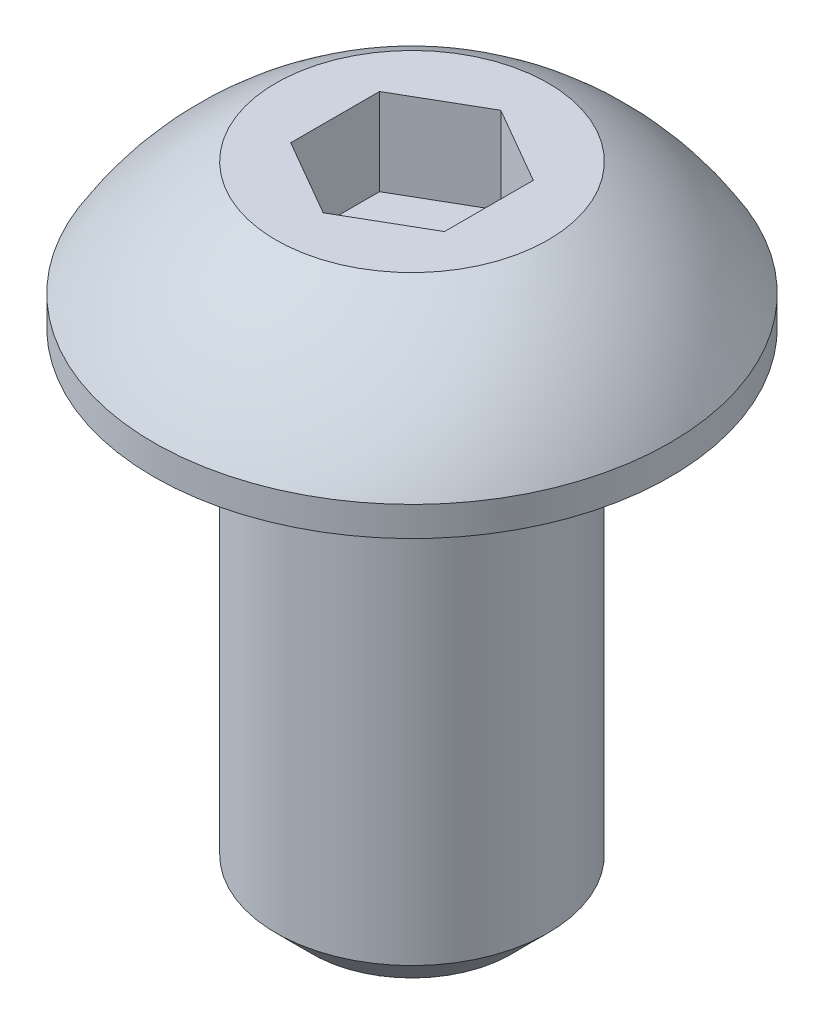
ISO-10303-21;
HEADER;
FILE_DESCRIPTION(('STEP AP214'),'2;1');
FILE_NAME('part.step','',(''),(''),'','','');
FILE_SCHEMA(('AUTOMOTIVE_DESIGN { 1 0 10303 214 1 1 1 1 }'));
ENDSEC;
DATA;
#1=APPLICATION_CONTEXT('core data for automotive mechanical design processes');
#2=APPLICATION_PROTOCOL_DEFINITION('international standard','automotive_design',2000,#1);
#3=PRODUCT_CONTEXT('',#1,'mechanical');
#4=PRODUCT('Part','Part','',(#3));
#5=PRODUCT_RELATED_PRODUCT_CATEGORY('part','',(#4));
#6=PRODUCT_DEFINITION_FORMATION('','',#4);
#7=PRODUCT_DEFINITION_CONTEXT('part definition',#1,'design');
#8=PRODUCT_DEFINITION('design','',#6,#7);
#9=PRODUCT_DEFINITION_SHAPE('','',#8);
#10=(LENGTH_UNIT() NAMED_UNIT(*) SI_UNIT(.MILLI.,.METRE.));
#11=(NAMED_UNIT(*) PLANE_ANGLE_UNIT() SI_UNIT($,.RADIAN.));
#12=(NAMED_UNIT(*) SI_UNIT($,.STERADIAN.) SOLID_ANGLE_UNIT());
#13=UNCERTAINTY_MEASURE_WITH_UNIT(LENGTH_MEASURE(1.E-05),#10,'distance_accuracy_value','');
#14=(GEOMETRIC_REPRESENTATION_CONTEXT(3) GLOBAL_UNCERTAINTY_ASSIGNED_CONTEXT((#13)) GLOBAL_UNIT_ASSIGNED_CONTEXT((#10,
#11,#12)) REPRESENTATION_CONTEXT('',''));
#15=CARTESIAN_POINT('',(0.,0.,0.));
#16=DIRECTION('',(0.,0.,1.));
#17=DIRECTION('',(1.,0.,0.));
#18=AXIS2_PLACEMENT_3D('',#15,#16,#17);
#19=CARTESIAN_POINT('',(0.,0.,0.));
#20=DIRECTION('',(0.,-1.,0.));
#21=DIRECTION('',(0.,0.,-1.));
#22=AXIS2_PLACEMENT_3D('',#19,#20,#21);
#23=PLANE('',#22);
#24=CARTESIAN_POINT('',(0.,0.,0.));
#25=DIRECTION('',(0.,-1.,0.));
#26=DIRECTION('',(0.,0.,-1.));
#27=AXIS2_PLACEMENT_3D('',#24,#25,#26);
#28=CIRCLE('',#27,1.752598482);
#29=CARTESIAN_POINT('',(0.,0.,-1.752598482));
#30=VERTEX_POINT('',#29);
#31=EDGE_CURVE('E11',#30,#30,#28,.T.);
#32=ORIENTED_EDGE('',*,*,#31,.F.);
#33=EDGE_LOOP('',(#32));
#34=FACE_BOUND('',#33,.T.);
#35=CARTESIAN_POINT('',(0.,0.,0.));
#36=DIRECTION('',(0.,-1.,0.));
#37=DIRECTION('',(0.,0.,-1.));
#38=AXIS2_PLACEMENT_3D('',#35,#36,#37);
#39=CIRCLE('',#38,3.327397118);
#40=CARTESIAN_POINT('',(0.,0.,-3.327397118));
#41=VERTEX_POINT('',#40);
#42=EDGE_CURVE('E41',#41,#41,#39,.T.);
#43=ORIENTED_EDGE('',*,*,#42,.T.);
#44=EDGE_LOOP('',(#43));
#45=FACE_BOUND('',#44,.T.);
#46=ADVANCED_FACE('F34',(#34,#45),#23,.T.);
#47=CARTESIAN_POINT('',(0.,0.,0.));
#48=DIRECTION('',(0.,-1.,0.));
#49=DIRECTION('',(0.,0.,-1.));
#50=AXIS2_PLACEMENT_3D('',#47,#48,#49);
#51=CYLINDRICAL_SURFACE('',#50,3.327397118);
#52=CARTESIAN_POINT('',(0.,0.38099967,0.));
#53=DIRECTION('',(0.,-1.,0.));
#54=DIRECTION('',(0.,0.,-1.));
#55=AXIS2_PLACEMENT_3D('',#52,#53,#54);
#56=CIRCLE('',#55,3.327397118);
#57=CARTESIAN_POINT('',(3.327397118,0.38099967,0.));
#58=VERTEX_POINT('',#57);
#59=EDGE_CURVE('E149',#58,#58,#56,.T.);
#60=ORIENTED_EDGE('',*,*,#59,.T.);
#61=EDGE_LOOP('',(#60));
#62=FACE_BOUND('',#61,.T.);
#63=ORIENTED_EDGE('',*,*,#42,.F.);
#64=EDGE_LOOP('',(#63));
#65=FACE_BOUND('',#64,.T.);
#66=ADVANCED_FACE('F155',(#62,#65),#51,.T.);
#67=CARTESIAN_POINT('',(0.,-1.59757103006897,0.));
#68=DIRECTION('',(0.,-1.,0.));
#69=DIRECTION('',(1.,0.,0.));
#70=AXIS2_PLACEMENT_3D('',#67,#68,#69);
#71=SPHERICAL_SURFACE('',#70,3.87121603582726);
#72=CARTESIAN_POINT('',(0.,1.854198394,0.));
#73=DIRECTION('',(0.,-1.,0.));
#74=DIRECTION('',(0.,0.,-1.));
#75=AXIS2_PLACEMENT_3D('',#72,#73,#74);
#76=CIRCLE('',#75,1.752598482);
#77=CARTESIAN_POINT('',(1.752598482,1.854198394,0.));
#78=VERTEX_POINT('',#77);
#79=EDGE_CURVE('E146',#78,#78,#76,.T.);
#80=CARTESIAN_POINT('',(1.752598482,1.854198394,0.));
#81=CARTESIAN_POINT('',(1.77289614956054,1.84389249863862,0.));
#82=CARTESIAN_POINT('',(1.79310289277541,1.833407527907,0.));
#83=CARTESIAN_POINT('',(1.83332828834059,1.81208278570635,0.));
#84=CARTESIAN_POINT('',(1.85334694069091,1.80124301423732,0.));
#85=CARTESIAN_POINT('',(1.89318991235382,1.77921202056495,0.));
#86=CARTESIAN_POINT('',(1.91301423166641,1.76802079836159,0.));
#87=CARTESIAN_POINT('',(1.95246237124119,1.74529039218042,0.));
#88=CARTESIAN_POINT('',(1.97208619150339,1.7337512082026,0.));
#89=CARTESIAN_POINT('',(2.01112722515749,1.71032846779068,0.));
#90=CARTESIAN_POINT('',(2.0305444385494,1.69844491135657,0.));
#91=CARTESIAN_POINT('',(2.06916621606512,1.67433712464308,0.));
#92=CARTESIAN_POINT('',(2.08837078018894,1.66211289436368,0.));
#93=CARTESIAN_POINT('',(2.12656128264541,1.63732756401914,0.));
#94=CARTESIAN_POINT('',(2.14554722097807,1.62476646395399,0.));
#95=CARTESIAN_POINT('',(2.18329456344632,1.5993113030838,0.));
#96=CARTESIAN_POINT('',(2.20205596758192,1.58641724227878,0.));
#97=CARTESIAN_POINT('',(2.23934840310352,1.56030017255124,0.));
#98=CARTESIAN_POINT('',(2.25787943448953,1.54707716362873,0.));
#99=CARTESIAN_POINT('',(2.29470535765722,1.52030631266819,0.));
#100=CARTESIAN_POINT('',(2.3130002494389,1.50675847063017,0.));
#101=CARTESIAN_POINT('',(2.34934820002827,1.47934216952571,0.));
#102=CARTESIAN_POINT('',(2.36740125883596,1.46547371045926,0.));
#103=CARTESIAN_POINT('',(2.40325992536653,1.43742049116184,0.));
#104=CARTESIAN_POINT('',(2.4210655330894,1.42323573093085,0.));
#105=CARTESIAN_POINT('',(2.45642375634614,1.3945543236009,0.));
#106=CARTESIAN_POINT('',(2.47397637188,1.38005767650195,0.));
#107=CARTESIAN_POINT('',(2.50882314838573,1.35075700679186,0.));
#108=CARTESIAN_POINT('',(2.52611730935759,1.33595298418073,0.));
#109=CARTESIAN_POINT('',(2.56044179479734,1.30604217045734,0.));
#110=CARTESIAN_POINT('',(2.57747211926524,1.29093537934508,0.));
#111=CARTESIAN_POINT('',(2.61126363186102,1.260423729852,0.));
#112=CARTESIAN_POINT('',(2.6280248199889,1.24501887147117,0.));
#113=CARTESIAN_POINT('',(2.66127284382381,1.21391588143207,0.));
#114=CARTESIAN_POINT('',(2.67775967953084,1.19821774977378,0.));
#115=CARTESIAN_POINT('',(2.71045386782166,1.16653309843746,0.));
#116=CARTESIAN_POINT('',(2.72666122040545,1.15054657875944,0.));
#117=CARTESIAN_POINT('',(2.75879139872256,1.11829012638769,0.));
#118=CARTESIAN_POINT('',(2.77471422445587,1.10202019369398,0.));
#119=CARTESIAN_POINT('',(2.80627039388951,1.06920197849305,0.));
#120=CARTESIAN_POINT('',(2.82190373758984,1.05265369598583,0.));
#121=CARTESIAN_POINT('',(2.85287607786179,1.01928393098249,0.));
#122=CARTESIAN_POINT('',(2.86821507443341,1.00246244848637,0.));
#123=CARTESIAN_POINT('',(2.89859394695308,0.968551518349709,0.));
#124=CARTESIAN_POINT('',(2.91363382290113,0.951462070709164,0.));
#125=CARTESIAN_POINT('',(2.94340977376492,0.917020528518732,0.));
#126=CARTESIAN_POINT('',(2.95814584868066,0.899668433968843,0.));
#127=CARTESIAN_POINT('',(2.98730961161471,0.864706997930974,0.));
#128=CARTESIAN_POINT('',(3.00173729963302,0.847097656442994,0.));
#129=CARTESIAN_POINT('',(3.03027979887426,0.811627206553683,0.));
#130=CARTESIAN_POINT('',(3.04439461009718,0.793766098152352,0.));
#131=CARTESIAN_POINT('',(3.07230696322747,0.757797672817449,0.));
#132=CARTESIAN_POINT('',(3.08610450513483,0.739690355883877,0.));
#133=CARTESIAN_POINT('',(3.11337802580868,0.703235148461348,0.));
#134=CARTESIAN_POINT('',(3.12685400457516,0.684887257972392,0.));
#135=CARTESIAN_POINT('',(3.15348020535915,0.647956613373252,0.));
#136=CARTESIAN_POINT('',(3.16663042737666,0.629373859263069,0.));
#137=CARTESIAN_POINT('',(3.19260102188228,0.591979270106218,0.));
#138=CARTESIAN_POINT('',(3.2054213943704,0.573167435059551,0.));
#139=CARTESIAN_POINT('',(3.2307283017304,0.535320539269472,0.));
#140=CARTESIAN_POINT('',(3.24321483660228,0.516285478526059,0.));
#141=CARTESIAN_POINT('',(3.26785017690333,0.477998051328932,0.));
#142=CARTESIAN_POINT('',(3.27999898233249,0.458745684875218,0.));
#143=CARTESIAN_POINT('',(3.30395510549819,0.420029651488912,0.));
#144=CARTESIAN_POINT('',(3.31576242323472,0.400565984556319,0.));
#145=CARTESIAN_POINT('',(3.327397118,0.38099967,0.));
#146=B_SPLINE_CURVE_WITH_KNOTS('',3,(#80,#81,#82,#83,#84,#85,#86,#87,#88,#89,#90,#91,#92,#93,
#94,#95,#96,#97,#98,#99,#100,#101,#102,#103,#104,#105,#106,#107,#108,#109,#110,#111,#112,#113,
#114,#115,#116,#117,#118,#119,#120,#121,#122,#123,#124,#125,#126,#127,#128,#129,#130,#131,#132,
#133,#134,#135,#136,#137,#138,#139,#140,#141,#142,#143,#144,#145),.UNSPECIFIED.,.F.,.F.,(4,2,2,
2,2,2,2,2,2,2,2,2,2,2,2,2,2,2,2,2,2,2,2,2,2,2,2,2,2,2,2,2,4),(0.,0.0682915805928647,
0.136583161185729,0.204874741778594,0.273166322371458,0.341457902964323,0.409749483557188,
0.478041064150053,0.546332644742917,0.614624225335782,0.682915805928646,0.751207386521511,
0.819498967114376,0.88779054770724,0.956082128300105,1.02437370889297,1.09266528948583,
1.1609568700787,1.22924845067156,1.29754003126443,1.36583161185729,1.43412319245016,
1.50241477304302,1.57070635363589,1.63899793422875,1.70728951482162,1.77558109541448,
1.84387267600735,1.91216425660021,1.98045583719307,2.04874741778594,2.1170389983788,
2.18533057897167),.UNSPECIFIED.);
#147=EDGE_CURVE('BSEAM157',#78,#58,#146,.T.);
#148=ORIENTED_EDGE('',*,*,#79,.T.);
#149=ORIENTED_EDGE('',*,*,#59,.F.);
#150=ORIENTED_EDGE('',*,*,#147,.T.);
#151=ORIENTED_EDGE('',*,*,#147,.F.);
#152=EDGE_LOOP('',(#148,#150,#149,#151));
#153=FACE_BOUND('',#152,.T.);
#154=ADVANCED_FACE('F157',(#153),#71,.T.);
#155=CARTESIAN_POINT('',(1.752598482,1.854198394,0.));
#156=DIRECTION('',(0.,1.,0.));
#157=DIRECTION('',(0.,0.,1.));
#158=AXIS2_PLACEMENT_3D('',#155,#156,#157);
#159=PLANE('',#158);
#160=DIRECTION('',(0.,0.,1.));
#161=VECTOR('',#160,1.);
#162=CARTESIAN_POINT('',(-0.990599142013621,1.854198394,-0.57192268130507));
#163=LINE('',#162,#161);
#164=CARTESIAN_POINT('',(-0.990599142013621,1.854198394,-0.57192268130507));
#165=VERTEX_POINT('',#164);
#166=CARTESIAN_POINT('',(-0.990599142013621,1.854198394,0.571922681264627));
#167=VERTEX_POINT('',#166);
#168=EDGE_CURVE('E48',#165,#167,#163,.T.);
#169=ORIENTED_EDGE('',*,*,#168,.F.);
#170=DIRECTION('',(-0.866025403784439,0.,0.5));
#171=VECTOR('',#170,1.);
#172=CARTESIAN_POINT('',(-9.72916336723E-12,1.854198394,-1.14384536260003));
#173=LINE('',#172,#171);
#174=CARTESIAN_POINT('',(-9.72916336723E-12,1.854198394,-1.14384536260003));
#175=VERTEX_POINT('',#174);
#176=EDGE_CURVE('E131',#175,#165,#173,.T.);
#177=ORIENTED_EDGE('',*,*,#176,.F.);
#178=DIRECTION('',(-0.866025403784439,0.,-0.5));
#179=VECTOR('',#178,1.);
#180=CARTESIAN_POINT('',(0.990599141994163,1.854198394,-0.57192268130507));
#181=LINE('',#180,#179);
#182=CARTESIAN_POINT('',(0.990599141994163,1.854198394,-0.57192268130507));
#183=VERTEX_POINT('',#182);
#184=EDGE_CURVE('E129',#183,#175,#181,.T.);
#185=ORIENTED_EDGE('',*,*,#184,.F.);
#186=DIRECTION('',(0.,0.,-1.));
#187=VECTOR('',#186,1.);
#188=CARTESIAN_POINT('',(0.990599141994163,1.854198394,0.571922681284848));
#189=LINE('',#188,#187);
#190=CARTESIAN_POINT('',(0.990599141994163,1.854198394,0.571922681284848));
#191=VERTEX_POINT('',#190);
#192=EDGE_CURVE('E96',#191,#183,#189,.T.);
#193=ORIENTED_EDGE('',*,*,#192,.F.);
#194=DIRECTION('',(0.866025403784439,0.,-0.5));
#195=VECTOR('',#194,1.);
#196=CARTESIAN_POINT('',(-9.72908120735777E-12,1.854198394,1.14384536257981));
#197=LINE('',#196,#195);
#198=CARTESIAN_POINT('',(-9.72908120735777E-12,1.854198394,1.14384536257981));
#199=VERTEX_POINT('',#198);
#200=EDGE_CURVE('E125',#199,#191,#197,.T.);
#201=ORIENTED_EDGE('',*,*,#200,.F.);
#202=DIRECTION('',(0.866025403776783,0.,0.500000000013259));
#203=VECTOR('',#202,1.);
#204=CARTESIAN_POINT('',(-0.990599142013621,1.854198394,0.571922681264626));
#205=LINE('',#204,#203);
#206=EDGE_CURVE('E122',#167,#199,#205,.T.);
#207=ORIENTED_EDGE('',*,*,#206,.F.);
#208=EDGE_LOOP('',(#169,#177,#185,#193,#201,#207));
#209=FACE_BOUND('',#208,.T.);
#210=ORIENTED_EDGE('',*,*,#79,.F.);
#211=EDGE_LOOP('',(#210));
#212=FACE_BOUND('',#211,.T.);
#213=ADVANCED_FACE('F163',(#209,#212),#159,.T.);
#214=CARTESIAN_POINT('',(0.,-6.3499945,0.));
#215=DIRECTION('',(0.,-1.,0.));
#216=DIRECTION('',(0.,0.,-1.));
#217=AXIS2_PLACEMENT_3D('',#214,#215,#216);
#218=PLANE('',#217);
#219=CARTESIAN_POINT('',(0.,-6.3499945,0.));
#220=DIRECTION('',(0.,-1.,0.));
#221=DIRECTION('',(0.,0.,-1.));
#222=AXIS2_PLACEMENT_3D('',#219,#220,#221);
#223=CIRCLE('',#222,1.2801588912);
#224=CARTESIAN_POINT('',(0.,-6.3499945,-1.2801588912));
#225=VERTEX_POINT('',#224);
#226=EDGE_CURVE('E143',#225,#225,#223,.T.);
#227=ORIENTED_EDGE('',*,*,#226,.T.);
#228=EDGE_LOOP('',(#227));
#229=FACE_BOUND('',#228,.T.);
#230=ADVANCED_FACE('F170',(#229),#218,.T.);
#231=CARTESIAN_POINT('',(0.,-6.3499945,0.));
#232=DIRECTION('',(0.,1.,0.));
#233=DIRECTION('',(0.,0.,1.));
#234=AXIS2_PLACEMENT_3D('',#231,#232,#233);
#235=CONICAL_SURFACE('',#234,1.2801588912,0.785398163397449);
#236=CARTESIAN_POINT('',(0.,-5.8775549092,0.));
#237=DIRECTION('',(0.,-1.,0.));
#238=DIRECTION('',(0.,0.,-1.));
#239=AXIS2_PLACEMENT_3D('',#236,#237,#238);
#240=CIRCLE('',#239,1.752598482);
#241=CARTESIAN_POINT('',(0.,-5.8775549092,-1.752598482));
#242=VERTEX_POINT('',#241);
#243=EDGE_CURVE('E135',#242,#242,#240,.T.);
#244=ORIENTED_EDGE('',*,*,#243,.T.);
#245=EDGE_LOOP('',(#244));
#246=FACE_BOUND('',#245,.T.);
#247=ORIENTED_EDGE('',*,*,#226,.F.);
#248=EDGE_LOOP('',(#247));
#249=FACE_BOUND('',#248,.T.);
#250=ADVANCED_FACE('F174',(#246,#249),#235,.T.);
#251=CARTESIAN_POINT('',(0.,0.,0.));
#252=DIRECTION('',(0.,-1.,0.));
#253=DIRECTION('',(0.,0.,-1.));
#254=AXIS2_PLACEMENT_3D('',#251,#252,#253);
#255=CYLINDRICAL_SURFACE('',#254,1.752598482);
#256=ORIENTED_EDGE('',*,*,#31,.T.);
#257=EDGE_LOOP('',(#256));
#258=FACE_BOUND('',#257,.T.);
#259=ORIENTED_EDGE('',*,*,#243,.F.);
#260=EDGE_LOOP('',(#259));
#261=FACE_BOUND('',#260,.T.);
#262=ADVANCED_FACE('F178',(#258,#261),#255,.T.);
#263=CARTESIAN_POINT('',(-0.990599142013621,0.736599362,-0.57192268130507));
#264=DIRECTION('',(-1.,0.,0.));
#265=DIRECTION('',(0.,0.,1.));
#266=AXIS2_PLACEMENT_3D('',#263,#264,#265);
#267=PLANE('',#266);
#268=ORIENTED_EDGE('',*,*,#168,.T.);
#269=DIRECTION('',(0.,1.,0.));
#270=VECTOR('',#269,1.);
#271=CARTESIAN_POINT('',(-0.990599142013621,0.736599362,0.571922681264626));
#272=LINE('',#271,#270);
#273=CARTESIAN_POINT('',(-0.990599142013621,0.736599362,0.571922681264626));
#274=VERTEX_POINT('',#273);
#275=EDGE_CURVE('E78',#274,#167,#272,.T.);
#276=ORIENTED_EDGE('',*,*,#275,.F.);
#277=DIRECTION('',(0.,0.,1.));
#278=VECTOR('',#277,1.);
#279=CARTESIAN_POINT('',(-0.990599142013621,0.736599362,-0.57192268130507));
#280=LINE('',#279,#278);
#281=CARTESIAN_POINT('',(-0.990599142013621,0.736599362,-0.57192268130507));
#282=VERTEX_POINT('',#281);
#283=EDGE_CURVE('E133',#282,#274,#280,.T.);
#284=ORIENTED_EDGE('',*,*,#283,.F.);
#285=DIRECTION('',(0.,1.,0.));
#286=VECTOR('',#285,1.);
#287=CARTESIAN_POINT('',(-0.990599142013621,0.736599362,-0.57192268130507));
#288=LINE('',#287,#286);
#289=EDGE_CURVE('E56',#282,#165,#288,.T.);
#290=ORIENTED_EDGE('',*,*,#289,.T.);
#291=EDGE_LOOP('',(#268,#276,#284,#290));
#292=FACE_BOUND('',#291,.T.);
#293=ADVANCED_FACE('F182',(#292),#267,.F.);
#294=CARTESIAN_POINT('',(-9.72916336723E-12,0.736599362,-1.14384536260003));
#295=DIRECTION('',(-0.5,0.,-0.866025403784439));
#296=DIRECTION('',(-0.866025403784439,0.,0.5));
#297=AXIS2_PLACEMENT_3D('',#294,#295,#296);
#298=PLANE('',#297);
#299=ORIENTED_EDGE('',*,*,#176,.T.);
#300=ORIENTED_EDGE('',*,*,#289,.F.);
#301=DIRECTION('',(-0.866025403784439,0.,0.5));
#302=VECTOR('',#301,1.);
#303=CARTESIAN_POINT('',(-9.72916336723E-12,0.736599362,-1.14384536260003));
#304=LINE('',#303,#302);
#305=CARTESIAN_POINT('',(-9.72916336723E-12,0.736599362,-1.14384536260003));
#306=VERTEX_POINT('',#305);
#307=EDGE_CURVE('E108',#306,#282,#304,.T.);
#308=ORIENTED_EDGE('',*,*,#307,.F.);
#309=DIRECTION('',(0.,1.,0.));
#310=VECTOR('',#309,1.);
#311=CARTESIAN_POINT('',(-9.72916336723E-12,0.736599362,-1.14384536260003));
#312=LINE('',#311,#310);
#313=EDGE_CURVE('E100',#306,#175,#312,.T.);
#314=ORIENTED_EDGE('',*,*,#313,.T.);
#315=EDGE_LOOP('',(#299,#300,#308,#314));
#316=FACE_BOUND('',#315,.T.);
#317=ADVANCED_FACE('F186',(#316),#298,.F.);
#318=CARTESIAN_POINT('',(0.990599141994163,0.736599362,-0.57192268130507));
#319=DIRECTION('',(0.5,0.,-0.866025403784438));
#320=DIRECTION('',(-0.866025403784439,0.,-0.5));
#321=AXIS2_PLACEMENT_3D('',#318,#319,#320);
#322=PLANE('',#321);
#323=ORIENTED_EDGE('',*,*,#184,.T.);
#324=ORIENTED_EDGE('',*,*,#313,.F.);
#325=DIRECTION('',(-0.866025403784439,0.,-0.5));
#326=VECTOR('',#325,1.);
#327=CARTESIAN_POINT('',(0.990599141994163,0.736599362,-0.57192268130507));
#328=LINE('',#327,#326);
#329=CARTESIAN_POINT('',(0.990599141994163,0.736599362,-0.57192268130507));
#330=VERTEX_POINT('',#329);
#331=EDGE_CURVE('E104',#330,#306,#328,.T.);
#332=ORIENTED_EDGE('',*,*,#331,.F.);
#333=DIRECTION('',(0.,1.,0.));
#334=VECTOR('',#333,1.);
#335=CARTESIAN_POINT('',(0.990599141994163,0.736599362,-0.57192268130507));
#336=LINE('',#335,#334);
#337=EDGE_CURVE('E89',#330,#183,#336,.T.);
#338=ORIENTED_EDGE('',*,*,#337,.T.);
#339=EDGE_LOOP('',(#323,#324,#332,#338));
#340=FACE_BOUND('',#339,.T.);
#341=ADVANCED_FACE('F105',(#340),#322,.F.);
#342=CARTESIAN_POINT('',(0.990599141994163,0.736599362,0.571922681284848));
#343=DIRECTION('',(1.,0.,0.));
#344=DIRECTION('',(0.,0.,-1.));
#345=AXIS2_PLACEMENT_3D('',#342,#343,#344);
#346=PLANE('',#345);
#347=ORIENTED_EDGE('',*,*,#192,.T.);
#348=ORIENTED_EDGE('',*,*,#337,.F.);
#349=DIRECTION('',(0.,0.,-1.));
#350=VECTOR('',#349,1.);
#351=CARTESIAN_POINT('',(0.990599141994163,0.736599362,0.571922681284848));
#352=LINE('',#351,#350);
#353=CARTESIAN_POINT('',(0.990599141994163,0.736599362,0.571922681284848));
#354=VERTEX_POINT('',#353);
#355=EDGE_CURVE('E93',#354,#330,#352,.T.);
#356=ORIENTED_EDGE('',*,*,#355,.F.);
#357=DIRECTION('',(0.,1.,0.));
#358=VECTOR('',#357,1.);
#359=CARTESIAN_POINT('',(0.990599141994163,0.736599362,0.571922681284848));
#360=LINE('',#359,#358);
#361=EDGE_CURVE('E101',#354,#191,#360,.T.);
#362=ORIENTED_EDGE('',*,*,#361,.T.);
#363=EDGE_LOOP('',(#347,#348,#356,#362));
#364=FACE_BOUND('',#363,.T.);
#365=ADVANCED_FACE('F91',(#364),#346,.F.);
#366=CARTESIAN_POINT('',(-9.72908120735777E-12,0.736599362,1.14384536257981));
#367=DIRECTION('',(0.5,0.,0.866025403784438));
#368=DIRECTION('',(0.866025403784439,0.,-0.5));
#369=AXIS2_PLACEMENT_3D('',#366,#367,#368);
#370=PLANE('',#369);
#371=ORIENTED_EDGE('',*,*,#200,.T.);
#372=ORIENTED_EDGE('',*,*,#361,.F.);
#373=DIRECTION('',(0.866025403784439,0.,-0.5));
#374=VECTOR('',#373,1.);
#375=CARTESIAN_POINT('',(-9.72908120735777E-12,0.736599362,1.14384536257981));
#376=LINE('',#375,#374);
#377=CARTESIAN_POINT('',(-9.72908120735777E-12,0.736599362,1.14384536257981));
#378=VERTEX_POINT('',#377);
#379=EDGE_CURVE('E114',#378,#354,#376,.T.);
#380=ORIENTED_EDGE('',*,*,#379,.F.);
#381=DIRECTION('',(0.,1.,0.));
#382=VECTOR('',#381,1.);
#383=CARTESIAN_POINT('',(-9.72908120735777E-12,0.736599362,1.14384536257981));
#384=LINE('',#383,#382);
#385=EDGE_CURVE('E138',#378,#199,#384,.T.);
#386=ORIENTED_EDGE('',*,*,#385,.T.);
#387=EDGE_LOOP('',(#371,#372,#380,#386));
#388=FACE_BOUND('',#387,.T.);
#389=ADVANCED_FACE('F190',(#388),#370,.F.);
#390=CARTESIAN_POINT('',(-0.990599142013621,0.736599362,0.571922681264626));
#391=DIRECTION('',(-0.500000000013259,0.,0.866025403776783));
#392=DIRECTION('',(0.866025403776784,0.,0.500000000013259));
#393=AXIS2_PLACEMENT_3D('',#390,#391,#392);
#394=PLANE('',#393);
#395=ORIENTED_EDGE('',*,*,#206,.T.);
#396=ORIENTED_EDGE('',*,*,#385,.F.);
#397=DIRECTION('',(0.866025403776783,0.,0.500000000013259));
#398=VECTOR('',#397,1.);
#399=CARTESIAN_POINT('',(-0.990599142013621,0.736599362,0.571922681264626));
#400=LINE('',#399,#398);
#401=EDGE_CURVE('E116',#274,#378,#400,.T.);
#402=ORIENTED_EDGE('',*,*,#401,.F.);
#403=ORIENTED_EDGE('',*,*,#275,.T.);
#404=EDGE_LOOP('',(#395,#396,#402,#403));
#405=FACE_BOUND('',#404,.T.);
#406=ADVANCED_FACE('F187',(#405),#394,.F.);
#407=CARTESIAN_POINT('',(-0.990599142013621,0.736599362,-0.57192268130507));
#408=DIRECTION('',(0.,-1.,0.));
#409=DIRECTION('',(0.,0.,-1.));
#410=AXIS2_PLACEMENT_3D('',#407,#408,#409);
#411=PLANE('',#410);
#412=ORIENTED_EDGE('',*,*,#283,.T.);
#413=ORIENTED_EDGE('',*,*,#401,.T.);
#414=ORIENTED_EDGE('',*,*,#379,.T.);
#415=ORIENTED_EDGE('',*,*,#355,.T.);
#416=ORIENTED_EDGE('',*,*,#331,.T.);
#417=ORIENTED_EDGE('',*,*,#307,.T.);
#418=EDGE_LOOP('',(#412,#413,#414,#415,#416,#417));
#419=FACE_BOUND('',#418,.T.);
#420=ADVANCED_FACE('F111',(#419),#411,.F.);
#421=CLOSED_SHELL('',(#46,#66,#154,#213,#230,#250,#262,#293,#317,#341,#365,#389,#406,#420));
#422=MANIFOLD_SOLID_BREP('B2',#421);
#423=ADVANCED_BREP_SHAPE_REPRESENTATION('',(#18,#422),#14);
#424=SHAPE_DEFINITION_REPRESENTATION(#9,#423);
ENDSEC;
END-ISO-10303-21;
